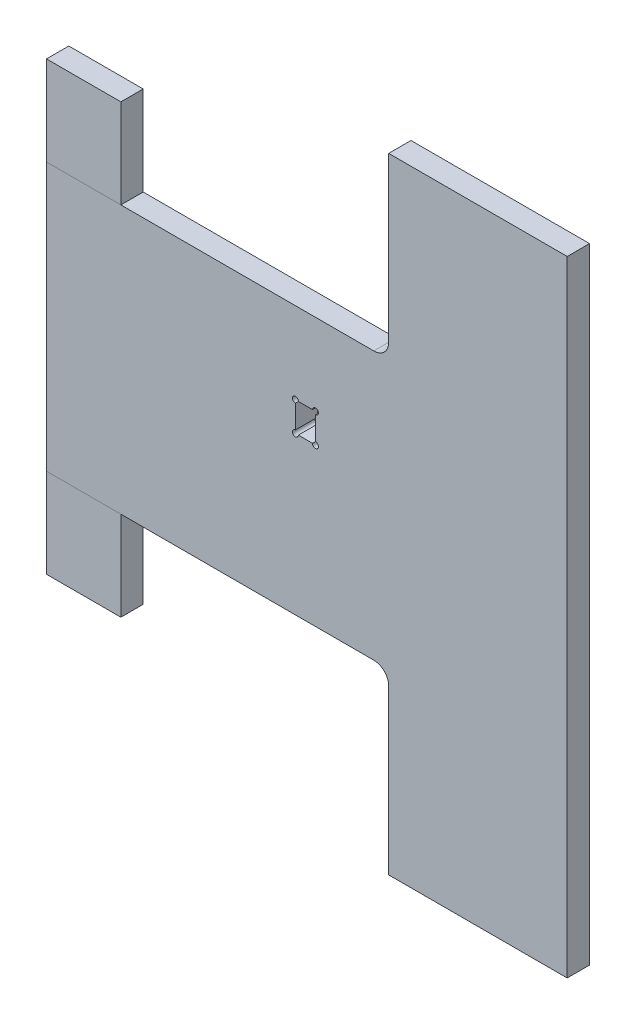
ISO-10303-21;
HEADER;
FILE_DESCRIPTION(('STEP AP214'),'2;1');
FILE_NAME('part.step','',(''),(''),'','','');
FILE_SCHEMA(('AUTOMOTIVE_DESIGN { 1 0 10303 214 1 1 1 1 }'));
ENDSEC;
DATA;
#1=APPLICATION_CONTEXT('core data for automotive mechanical design processes');
#2=APPLICATION_PROTOCOL_DEFINITION('international standard','automotive_design',2000,#1);
#3=PRODUCT_CONTEXT('',#1,'mechanical');
#4=PRODUCT('Part','Part','',(#3));
#5=PRODUCT_RELATED_PRODUCT_CATEGORY('part','',(#4));
#6=PRODUCT_DEFINITION_FORMATION('','',#4);
#7=PRODUCT_DEFINITION_CONTEXT('part definition',#1,'design');
#8=PRODUCT_DEFINITION('design','',#6,#7);
#9=PRODUCT_DEFINITION_SHAPE('','',#8);
#10=(LENGTH_UNIT() NAMED_UNIT(*) SI_UNIT(.MILLI.,.METRE.));
#11=(NAMED_UNIT(*) PLANE_ANGLE_UNIT() SI_UNIT($,.RADIAN.));
#12=(NAMED_UNIT(*) SI_UNIT($,.STERADIAN.) SOLID_ANGLE_UNIT());
#13=UNCERTAINTY_MEASURE_WITH_UNIT(LENGTH_MEASURE(1.E-05),#10,'distance_accuracy_value','');
#14=(GEOMETRIC_REPRESENTATION_CONTEXT(3) GLOBAL_UNCERTAINTY_ASSIGNED_CONTEXT((#13)) GLOBAL_UNIT_ASSIGNED_CONTEXT((#10,
#11,#12)) REPRESENTATION_CONTEXT('',''));
#15=CARTESIAN_POINT('',(0.,0.,0.));
#16=DIRECTION('',(0.,0.,1.));
#17=DIRECTION('',(1.,0.,0.));
#18=AXIS2_PLACEMENT_3D('',#15,#16,#17);
#19=CARTESIAN_POINT('',(0.,-60.,15.));
#20=DIRECTION('',(1.,0.,0.));
#21=DIRECTION('',(0.,0.,-1.));
#22=AXIS2_PLACEMENT_3D('',#19,#20,#21);
#23=PLANE('',#22);
#24=DIRECTION('',(0.,0.,-1.));
#25=VECTOR('',#24,1.);
#26=CARTESIAN_POINT('',(0.,0.,15.));
#27=LINE('',#26,#25);
#28=CARTESIAN_POINT('',(0.,0.,15.));
#29=VERTEX_POINT('',#28);
#30=CARTESIAN_POINT('',(0.,0.,0.));
#31=VERTEX_POINT('',#30);
#32=EDGE_CURVE('E107',#29,#31,#27,.T.);
#33=ORIENTED_EDGE('',*,*,#32,.T.);
#34=DIRECTION('',(0.,1.,0.));
#35=VECTOR('',#34,1.);
#36=CARTESIAN_POINT('',(0.,-60.,0.));
#37=LINE('',#36,#35);
#38=CARTESIAN_POINT('',(0.,-60.,0.));
#39=VERTEX_POINT('',#38);
#40=EDGE_CURVE('E12',#39,#31,#37,.T.);
#41=ORIENTED_EDGE('',*,*,#40,.F.);
#42=DIRECTION('',(0.,0.,-1.));
#43=VECTOR('',#42,1.);
#44=CARTESIAN_POINT('',(0.,-60.,15.));
#45=LINE('',#44,#43);
#46=CARTESIAN_POINT('',(0.,-60.,15.));
#47=VERTEX_POINT('',#46);
#48=EDGE_CURVE('E95',#47,#39,#45,.T.);
#49=ORIENTED_EDGE('',*,*,#48,.F.);
#50=DIRECTION('',(0.,1.,0.));
#51=VECTOR('',#50,1.);
#52=CARTESIAN_POINT('',(0.,-60.,15.));
#53=LINE('',#52,#51);
#54=EDGE_CURVE('E103',#47,#29,#53,.T.);
#55=ORIENTED_EDGE('',*,*,#54,.T.);
#56=EDGE_LOOP('',(#33,#41,#49,#55));
#57=FACE_BOUND('',#56,.T.);
#58=ADVANCED_FACE('F44',(#57),#23,.F.);
#59=CARTESIAN_POINT('',(0.,-60.,0.));
#60=DIRECTION('',(0.,0.,1.));
#61=DIRECTION('',(1.,0.,0.));
#62=AXIS2_PLACEMENT_3D('',#59,#60,#61);
#63=PLANE('',#62);
#64=DIRECTION('',(1.,0.,0.));
#65=VECTOR('',#64,1.);
#66=CARTESIAN_POINT('',(0.,0.,0.));
#67=LINE('',#66,#65);
#68=CARTESIAN_POINT('',(50.,0.,0.));
#69=VERTEX_POINT('',#68);
#70=EDGE_CURVE('E99',#31,#69,#67,.T.);
#71=ORIENTED_EDGE('',*,*,#70,.T.);
#72=DIRECTION('',(0.,1.,0.));
#73=VECTOR('',#72,1.);
#74=CARTESIAN_POINT('',(50.,-60.,0.));
#75=LINE('',#74,#73);
#76=CARTESIAN_POINT('',(50.,-60.,0.));
#77=VERTEX_POINT('',#76);
#78=EDGE_CURVE('E52',#77,#69,#75,.T.);
#79=ORIENTED_EDGE('',*,*,#78,.F.);
#80=DIRECTION('',(1.,0.,0.));
#81=VECTOR('',#80,1.);
#82=CARTESIAN_POINT('',(0.,-60.,0.));
#83=LINE('',#82,#81);
#84=EDGE_CURVE('E90',#39,#77,#83,.T.);
#85=ORIENTED_EDGE('',*,*,#84,.F.);
#86=ORIENTED_EDGE('',*,*,#40,.T.);
#87=EDGE_LOOP('',(#71,#79,#85,#86));
#88=FACE_BOUND('',#87,.T.);
#89=ADVANCED_FACE('F98',(#88),#63,.F.);
#90=CARTESIAN_POINT('',(50.,-60.,0.));
#91=DIRECTION('',(-1.,0.,0.));
#92=DIRECTION('',(0.,0.,1.));
#93=AXIS2_PLACEMENT_3D('',#90,#91,#92);
#94=PLANE('',#93);
#95=DIRECTION('',(0.,0.,1.));
#96=VECTOR('',#95,1.);
#97=CARTESIAN_POINT('',(50.,0.,0.));
#98=LINE('',#97,#96);
#99=CARTESIAN_POINT('',(50.,0.,15.));
#100=VERTEX_POINT('',#99);
#101=EDGE_CURVE('E77',#69,#100,#98,.T.);
#102=ORIENTED_EDGE('',*,*,#101,.T.);
#103=DIRECTION('',(0.,1.,0.));
#104=VECTOR('',#103,1.);
#105=CARTESIAN_POINT('',(50.,-60.,15.));
#106=LINE('',#105,#104);
#107=CARTESIAN_POINT('',(50.,-60.,15.));
#108=VERTEX_POINT('',#107);
#109=EDGE_CURVE('E100',#108,#100,#106,.T.);
#110=ORIENTED_EDGE('',*,*,#109,.F.);
#111=DIRECTION('',(0.,0.,1.));
#112=VECTOR('',#111,1.);
#113=CARTESIAN_POINT('',(50.,-60.,0.));
#114=LINE('',#113,#112);
#115=EDGE_CURVE('E93',#77,#108,#114,.T.);
#116=ORIENTED_EDGE('',*,*,#115,.F.);
#117=ORIENTED_EDGE('',*,*,#78,.T.);
#118=EDGE_LOOP('',(#102,#110,#116,#117));
#119=FACE_BOUND('',#118,.T.);
#120=ADVANCED_FACE('F101',(#119),#94,.F.);
#121=CARTESIAN_POINT('',(50.,-60.,15.));
#122=DIRECTION('',(0.,0.,-1.));
#123=DIRECTION('',(-1.,0.,0.));
#124=AXIS2_PLACEMENT_3D('',#121,#122,#123);
#125=PLANE('',#124);
#126=DIRECTION('',(-1.,0.,0.));
#127=VECTOR('',#126,1.);
#128=CARTESIAN_POINT('',(50.,0.,15.));
#129=LINE('',#128,#127);
#130=EDGE_CURVE('E83',#100,#29,#129,.T.);
#131=ORIENTED_EDGE('',*,*,#130,.T.);
#132=ORIENTED_EDGE('',*,*,#54,.F.);
#133=DIRECTION('',(-1.,0.,0.));
#134=VECTOR('',#133,1.);
#135=CARTESIAN_POINT('',(50.,-60.,15.));
#136=LINE('',#135,#134);
#137=EDGE_CURVE('E60',#108,#47,#136,.T.);
#138=ORIENTED_EDGE('',*,*,#137,.F.);
#139=ORIENTED_EDGE('',*,*,#109,.T.);
#140=EDGE_LOOP('',(#131,#132,#138,#139));
#141=FACE_BOUND('',#140,.T.);
#142=ADVANCED_FACE('F114',(#141),#125,.F.);
#143=CARTESIAN_POINT('',(0.,-60.,0.));
#144=DIRECTION('',(0.,-1.,0.));
#145=DIRECTION('',(0.,0.,-1.));
#146=AXIS2_PLACEMENT_3D('',#143,#144,#145);
#147=PLANE('',#146);
#148=ORIENTED_EDGE('',*,*,#48,.T.);
#149=ORIENTED_EDGE('',*,*,#84,.T.);
#150=ORIENTED_EDGE('',*,*,#115,.T.);
#151=ORIENTED_EDGE('',*,*,#137,.T.);
#152=EDGE_LOOP('',(#148,#149,#150,#151));
#153=FACE_BOUND('',#152,.T.);
#154=ADVANCED_FACE('F91',(#153),#147,.T.);
#155=CARTESIAN_POINT('',(0.,0.,0.));
#156=DIRECTION('',(0.,-1.,0.));
#157=DIRECTION('',(0.,0.,-1.));
#158=AXIS2_PLACEMENT_3D('',#155,#156,#157);
#159=PLANE('',#158);
#160=ORIENTED_EDGE('',*,*,#32,.F.);
#161=ORIENTED_EDGE('',*,*,#130,.F.);
#162=ORIENTED_EDGE('',*,*,#101,.F.);
#163=ORIENTED_EDGE('',*,*,#70,.F.);
#164=EDGE_LOOP('',(#160,#161,#162,#163));
#165=FACE_BOUND('',#164,.T.);
#166=ADVANCED_FACE('F117',(#165),#159,.F.);
#167=CLOSED_SHELL('',(#58,#89,#120,#142,#154,#166));
#168=MANIFOLD_SOLID_BREP('B2',#167);
#169=CARTESIAN_POINT('',(0.,240.,0.));
#170=DIRECTION('',(1.,0.,0.));
#171=DIRECTION('',(0.,0.,-1.));
#172=AXIS2_PLACEMENT_3D('',#169,#170,#171);
#173=PLANE('',#172);
#174=DIRECTION('',(0.,0.,1.));
#175=VECTOR('',#174,1.);
#176=CARTESIAN_POINT('',(0.,180.,0.));
#177=LINE('',#176,#175);
#178=CARTESIAN_POINT('',(0.,180.,0.));
#179=VERTEX_POINT('',#178);
#180=CARTESIAN_POINT('',(0.,180.,15.));
#181=VERTEX_POINT('',#180);
#182=EDGE_CURVE('E240',#179,#181,#177,.T.);
#183=ORIENTED_EDGE('',*,*,#182,.T.);
#184=DIRECTION('',(0.,-1.,0.));
#185=VECTOR('',#184,1.);
#186=CARTESIAN_POINT('',(0.,240.,15.));
#187=LINE('',#186,#185);
#188=CARTESIAN_POINT('',(0.,240.,15.));
#189=VERTEX_POINT('',#188);
#190=EDGE_CURVE('E42',#189,#181,#187,.T.);
#191=ORIENTED_EDGE('',*,*,#190,.F.);
#192=DIRECTION('',(0.,0.,1.));
#193=VECTOR('',#192,1.);
#194=CARTESIAN_POINT('',(0.,240.,0.));
#195=LINE('',#194,#193);
#196=CARTESIAN_POINT('',(0.,240.,0.));
#197=VERTEX_POINT('',#196);
#198=EDGE_CURVE('E228',#197,#189,#195,.T.);
#199=ORIENTED_EDGE('',*,*,#198,.F.);
#200=DIRECTION('',(0.,-1.,0.));
#201=VECTOR('',#200,1.);
#202=CARTESIAN_POINT('',(0.,240.,0.));
#203=LINE('',#202,#201);
#204=EDGE_CURVE('E236',#197,#179,#203,.T.);
#205=ORIENTED_EDGE('',*,*,#204,.T.);
#206=EDGE_LOOP('',(#183,#191,#199,#205));
#207=FACE_BOUND('',#206,.T.);
#208=ADVANCED_FACE('F177',(#207),#173,.F.);
#209=CARTESIAN_POINT('',(0.,240.,15.));
#210=DIRECTION('',(0.,0.,-1.));
#211=DIRECTION('',(-1.,0.,0.));
#212=AXIS2_PLACEMENT_3D('',#209,#210,#211);
#213=PLANE('',#212);
#214=DIRECTION('',(1.,0.,0.));
#215=VECTOR('',#214,1.);
#216=CARTESIAN_POINT('',(0.,180.,15.));
#217=LINE('',#216,#215);
#218=CARTESIAN_POINT('',(50.,180.,15.));
#219=VERTEX_POINT('',#218);
#220=EDGE_CURVE('E232',#181,#219,#217,.T.);
#221=ORIENTED_EDGE('',*,*,#220,.T.);
#222=DIRECTION('',(0.,-1.,0.));
#223=VECTOR('',#222,1.);
#224=CARTESIAN_POINT('',(50.,240.,15.));
#225=LINE('',#224,#223);
#226=CARTESIAN_POINT('',(50.,240.,15.));
#227=VERTEX_POINT('',#226);
#228=EDGE_CURVE('E185',#227,#219,#225,.T.);
#229=ORIENTED_EDGE('',*,*,#228,.F.);
#230=DIRECTION('',(1.,0.,0.));
#231=VECTOR('',#230,1.);
#232=CARTESIAN_POINT('',(0.,240.,15.));
#233=LINE('',#232,#231);
#234=EDGE_CURVE('E223',#189,#227,#233,.T.);
#235=ORIENTED_EDGE('',*,*,#234,.F.);
#236=ORIENTED_EDGE('',*,*,#190,.T.);
#237=EDGE_LOOP('',(#221,#229,#235,#236));
#238=FACE_BOUND('',#237,.T.);
#239=ADVANCED_FACE('F231',(#238),#213,.F.);
#240=CARTESIAN_POINT('',(50.,240.,15.));
#241=DIRECTION('',(-1.,0.,0.));
#242=DIRECTION('',(0.,0.,1.));
#243=AXIS2_PLACEMENT_3D('',#240,#241,#242);
#244=PLANE('',#243);
#245=DIRECTION('',(0.,0.,-1.));
#246=VECTOR('',#245,1.);
#247=CARTESIAN_POINT('',(50.,180.,15.));
#248=LINE('',#247,#246);
#249=CARTESIAN_POINT('',(50.,180.,0.));
#250=VERTEX_POINT('',#249);
#251=EDGE_CURVE('E210',#219,#250,#248,.T.);
#252=ORIENTED_EDGE('',*,*,#251,.T.);
#253=DIRECTION('',(0.,-1.,0.));
#254=VECTOR('',#253,1.);
#255=CARTESIAN_POINT('',(50.,240.,0.));
#256=LINE('',#255,#254);
#257=CARTESIAN_POINT('',(50.,240.,0.));
#258=VERTEX_POINT('',#257);
#259=EDGE_CURVE('E233',#258,#250,#256,.T.);
#260=ORIENTED_EDGE('',*,*,#259,.F.);
#261=DIRECTION('',(0.,0.,-1.));
#262=VECTOR('',#261,1.);
#263=CARTESIAN_POINT('',(50.,240.,15.));
#264=LINE('',#263,#262);
#265=EDGE_CURVE('E226',#227,#258,#264,.T.);
#266=ORIENTED_EDGE('',*,*,#265,.F.);
#267=ORIENTED_EDGE('',*,*,#228,.T.);
#268=EDGE_LOOP('',(#252,#260,#266,#267));
#269=FACE_BOUND('',#268,.T.);
#270=ADVANCED_FACE('F234',(#269),#244,.F.);
#271=CARTESIAN_POINT('',(50.,240.,0.));
#272=DIRECTION('',(0.,0.,1.));
#273=DIRECTION('',(1.,0.,0.));
#274=AXIS2_PLACEMENT_3D('',#271,#272,#273);
#275=PLANE('',#274);
#276=DIRECTION('',(-1.,0.,0.));
#277=VECTOR('',#276,1.);
#278=CARTESIAN_POINT('',(50.,180.,0.));
#279=LINE('',#278,#277);
#280=EDGE_CURVE('E216',#250,#179,#279,.T.);
#281=ORIENTED_EDGE('',*,*,#280,.T.);
#282=ORIENTED_EDGE('',*,*,#204,.F.);
#283=DIRECTION('',(-1.,0.,0.));
#284=VECTOR('',#283,1.);
#285=CARTESIAN_POINT('',(50.,240.,0.));
#286=LINE('',#285,#284);
#287=EDGE_CURVE('E193',#258,#197,#286,.T.);
#288=ORIENTED_EDGE('',*,*,#287,.F.);
#289=ORIENTED_EDGE('',*,*,#259,.T.);
#290=EDGE_LOOP('',(#281,#282,#288,#289));
#291=FACE_BOUND('',#290,.T.);
#292=ADVANCED_FACE('F247',(#291),#275,.F.);
#293=CARTESIAN_POINT('',(0.,240.,15.));
#294=DIRECTION('',(0.,1.,0.));
#295=DIRECTION('',(0.,0.,1.));
#296=AXIS2_PLACEMENT_3D('',#293,#294,#295);
#297=PLANE('',#296);
#298=ORIENTED_EDGE('',*,*,#198,.T.);
#299=ORIENTED_EDGE('',*,*,#234,.T.);
#300=ORIENTED_EDGE('',*,*,#265,.T.);
#301=ORIENTED_EDGE('',*,*,#287,.T.);
#302=EDGE_LOOP('',(#298,#299,#300,#301));
#303=FACE_BOUND('',#302,.T.);
#304=ADVANCED_FACE('F224',(#303),#297,.T.);
#305=CARTESIAN_POINT('',(0.,180.,15.));
#306=DIRECTION('',(0.,1.,0.));
#307=DIRECTION('',(0.,0.,1.));
#308=AXIS2_PLACEMENT_3D('',#305,#306,#307);
#309=PLANE('',#308);
#310=ORIENTED_EDGE('',*,*,#182,.F.);
#311=ORIENTED_EDGE('',*,*,#280,.F.);
#312=ORIENTED_EDGE('',*,*,#251,.F.);
#313=ORIENTED_EDGE('',*,*,#220,.F.);
#314=EDGE_LOOP('',(#310,#311,#312,#313));
#315=FACE_BOUND('',#314,.T.);
#316=ADVANCED_FACE('F250',(#315),#309,.F.);
#317=CLOSED_SHELL('',(#208,#239,#270,#292,#304,#316));
#318=MANIFOLD_SOLID_BREP('B6',#317);
#319=CARTESIAN_POINT('',(0.,0.,15.));
#320=DIRECTION('',(0.,1.,0.));
#321=DIRECTION('',(0.,0.,1.));
#322=AXIS2_PLACEMENT_3D('',#319,#320,#321);
#323=PLANE('',#322);
#324=DIRECTION('',(1.,0.,0.));
#325=VECTOR('',#324,1.);
#326=CARTESIAN_POINT('',(0.,0.,0.));
#327=LINE('',#326,#325);
#328=CARTESIAN_POINT('',(0.,0.,0.));
#329=VERTEX_POINT('',#328);
#330=CARTESIAN_POINT('',(220.,0.,0.));
#331=VERTEX_POINT('',#330);
#332=EDGE_CURVE('E532',#329,#331,#327,.T.);
#333=ORIENTED_EDGE('',*,*,#332,.T.);
#334=DIRECTION('',(0.,0.,-1.));
#335=VECTOR('',#334,1.);
#336=CARTESIAN_POINT('',(220.,0.,15.));
#337=LINE('',#336,#335);
#338=CARTESIAN_POINT('',(220.,0.,15.));
#339=VERTEX_POINT('',#338);
#340=EDGE_CURVE('E546',#331,#339,#337,.F.);
#341=ORIENTED_EDGE('',*,*,#340,.T.);
#342=DIRECTION('',(1.,0.,0.));
#343=VECTOR('',#342,1.);
#344=CARTESIAN_POINT('',(0.,0.,15.));
#345=LINE('',#344,#343);
#346=CARTESIAN_POINT('',(0.,0.,15.));
#347=VERTEX_POINT('',#346);
#348=EDGE_CURVE('E521',#347,#339,#345,.T.);
#349=ORIENTED_EDGE('',*,*,#348,.F.);
#350=DIRECTION('',(0.,0.,-1.));
#351=VECTOR('',#350,1.);
#352=CARTESIAN_POINT('',(0.,0.,15.));
#353=LINE('',#352,#351);
#354=EDGE_CURVE('E561',#347,#329,#353,.T.);
#355=ORIENTED_EDGE('',*,*,#354,.T.);
#356=EDGE_LOOP('',(#333,#341,#349,#355));
#357=FACE_BOUND('',#356,.T.);
#358=ADVANCED_FACE('F301',(#357),#323,.F.);
#359=CARTESIAN_POINT('',(0.,180.,15.));
#360=DIRECTION('',(0.,-1.,0.));
#361=DIRECTION('',(0.,0.,-1.));
#362=AXIS2_PLACEMENT_3D('',#359,#360,#361);
#363=PLANE('',#362);
#364=DIRECTION('',(-1.,0.,0.));
#365=VECTOR('',#364,1.);
#366=CARTESIAN_POINT('',(0.,180.,15.));
#367=LINE('',#366,#365);
#368=CARTESIAN_POINT('',(220.,180.,15.));
#369=VERTEX_POINT('',#368);
#370=CARTESIAN_POINT('',(0.,180.,15.));
#371=VERTEX_POINT('',#370);
#372=EDGE_CURVE('E531',#369,#371,#367,.T.);
#373=ORIENTED_EDGE('',*,*,#372,.F.);
#374=DIRECTION('',(0.,0.,1.));
#375=VECTOR('',#374,1.);
#376=CARTESIAN_POINT('',(220.,180.,0.));
#377=LINE('',#376,#375);
#378=CARTESIAN_POINT('',(220.,180.,0.));
#379=VERTEX_POINT('',#378);
#380=EDGE_CURVE('E323',#369,#379,#377,.F.);
#381=ORIENTED_EDGE('',*,*,#380,.T.);
#382=DIRECTION('',(-1.,0.,0.));
#383=VECTOR('',#382,1.);
#384=CARTESIAN_POINT('',(0.,180.,0.));
#385=LINE('',#384,#383);
#386=CARTESIAN_POINT('',(0.,180.,0.));
#387=VERTEX_POINT('',#386);
#388=EDGE_CURVE('E522',#379,#387,#385,.T.);
#389=ORIENTED_EDGE('',*,*,#388,.T.);
#390=DIRECTION('',(0.,0.,-1.));
#391=VECTOR('',#390,1.);
#392=CARTESIAN_POINT('',(0.,180.,15.));
#393=LINE('',#392,#391);
#394=EDGE_CURVE('E558',#371,#387,#393,.T.);
#395=ORIENTED_EDGE('',*,*,#394,.F.);
#396=EDGE_LOOP('',(#373,#381,#389,#395));
#397=FACE_BOUND('',#396,.T.);
#398=ADVANCED_FACE('F620',(#397),#363,.F.);
#399=CARTESIAN_POINT('',(0.,0.,15.));
#400=DIRECTION('',(1.,0.,0.));
#401=DIRECTION('',(0.,0.,-1.));
#402=AXIS2_PLACEMENT_3D('',#399,#400,#401);
#403=PLANE('',#402);
#404=DIRECTION('',(0.,-1.,0.));
#405=VECTOR('',#404,1.);
#406=CARTESIAN_POINT('',(0.,0.,0.));
#407=LINE('',#406,#405);
#408=EDGE_CURVE('E508',#387,#329,#407,.T.);
#409=ORIENTED_EDGE('',*,*,#408,.T.);
#410=ORIENTED_EDGE('',*,*,#354,.F.);
#411=DIRECTION('',(0.,-1.,0.));
#412=VECTOR('',#411,1.);
#413=CARTESIAN_POINT('',(0.,0.,15.));
#414=LINE('',#413,#412);
#415=EDGE_CURVE('E518',#371,#347,#414,.T.);
#416=ORIENTED_EDGE('',*,*,#415,.F.);
#417=ORIENTED_EDGE('',*,*,#394,.T.);
#418=EDGE_LOOP('',(#409,#410,#416,#417));
#419=FACE_BOUND('',#418,.T.);
#420=ADVANCED_FACE('F625',(#419),#403,.F.);
#421=CARTESIAN_POINT('',(0.,180.,15.));
#422=DIRECTION('',(0.,0.,-1.));
#423=DIRECTION('',(-1.,0.,0.));
#424=AXIS2_PLACEMENT_3D('',#421,#422,#423);
#425=PLANE('',#424);
#426=DIRECTION('',(0.,-1.,0.));
#427=VECTOR('',#426,1.);
#428=CARTESIAN_POINT('',(350.,180.,15.));
#429=LINE('',#428,#427);
#430=CARTESIAN_POINT('',(350.,300.,15.));
#431=VERTEX_POINT('',#430);
#432=CARTESIAN_POINT('',(350.,-120.,15.));
#433=VERTEX_POINT('',#432);
#434=EDGE_CURVE('E437',#431,#433,#429,.T.);
#435=ORIENTED_EDGE('',*,*,#434,.F.);
#436=DIRECTION('',(1.,0.,0.));
#437=VECTOR('',#436,1.);
#438=CARTESIAN_POINT('',(330.,300.,15.));
#439=LINE('',#438,#437);
#440=CARTESIAN_POINT('',(230.,300.,15.));
#441=VERTEX_POINT('',#440);
#442=EDGE_CURVE('E426',#441,#431,#439,.T.);
#443=ORIENTED_EDGE('',*,*,#442,.F.);
#444=DIRECTION('',(0.,-1.,0.));
#445=VECTOR('',#444,1.);
#446=CARTESIAN_POINT('',(230.,300.,15.));
#447=LINE('',#446,#445);
#448=CARTESIAN_POINT('',(230.,190.,15.));
#449=VERTEX_POINT('',#448);
#450=EDGE_CURVE('E434',#441,#449,#447,.T.);
#451=ORIENTED_EDGE('',*,*,#450,.T.);
#452=CARTESIAN_POINT('',(220.,190.,15.));
#453=DIRECTION('',(0.,0.,-1.));
#454=DIRECTION('',(-1.,0.,0.));
#455=AXIS2_PLACEMENT_3D('',#452,#453,#454);
#456=CIRCLE('',#455,10.);
#457=EDGE_CURVE('E316',#449,#369,#456,.T.);
#458=ORIENTED_EDGE('',*,*,#457,.T.);
#459=ORIENTED_EDGE('',*,*,#372,.T.);
#460=ORIENTED_EDGE('',*,*,#415,.T.);
#461=ORIENTED_EDGE('',*,*,#348,.T.);
#462=CARTESIAN_POINT('',(220.,-9.99999999999999,15.));
#463=DIRECTION('',(0.,0.,-1.));
#464=DIRECTION('',(-1.,0.,0.));
#465=AXIS2_PLACEMENT_3D('',#462,#463,#464);
#466=CIRCLE('',#465,10.);
#467=CARTESIAN_POINT('',(230.,-9.99999999999999,15.));
#468=VERTEX_POINT('',#467);
#469=EDGE_CURVE('E587',#339,#468,#466,.T.);
#470=ORIENTED_EDGE('',*,*,#469,.T.);
#471=DIRECTION('',(0.,1.,0.));
#472=VECTOR('',#471,1.);
#473=CARTESIAN_POINT('',(230.,-120.,15.));
#474=LINE('',#473,#472);
#475=CARTESIAN_POINT('',(230.,-120.,15.));
#476=VERTEX_POINT('',#475);
#477=EDGE_CURVE('E460',#476,#468,#474,.T.);
#478=ORIENTED_EDGE('',*,*,#477,.F.);
#479=DIRECTION('',(-1.,0.,0.));
#480=VECTOR('',#479,1.);
#481=CARTESIAN_POINT('',(330.,-120.,15.));
#482=LINE('',#481,#480);
#483=EDGE_CURVE('E441',#433,#476,#482,.T.);
#484=ORIENTED_EDGE('',*,*,#483,.F.);
#485=EDGE_LOOP('',(#435,#443,#451,#458,#459,#460,#461,#470,#478,#484));
#486=FACE_BOUND('',#485,.T.);
#487=DIRECTION('',(-1.,0.,0.));
#488=VECTOR('',#487,1.);
#489=CARTESIAN_POINT('',(180.8,125.25,15.));
#490=LINE('',#489,#488);
#491=CARTESIAN_POINT('',(178.8,125.25,15.));
#492=VERTEX_POINT('',#491);
#493=CARTESIAN_POINT('',(169.3,125.25,15.));
#494=VERTEX_POINT('',#493);
#495=EDGE_CURVE('E500',#492,#494,#490,.T.);
#496=ORIENTED_EDGE('',*,*,#495,.F.);
#497=CARTESIAN_POINT('',(180.8,125.25,15.));
#498=DIRECTION('',(0.,0.,1.));
#499=DIRECTION('',(1.,0.,0.));
#500=AXIS2_PLACEMENT_3D('',#497,#498,#499);
#501=CIRCLE('',#500,2.);
#502=CARTESIAN_POINT('',(180.8,123.25,15.));
#503=VERTEX_POINT('',#502);
#504=EDGE_CURVE('E466',#503,#492,#501,.T.);
#505=ORIENTED_EDGE('',*,*,#504,.F.);
#506=DIRECTION('',(0.,1.,0.));
#507=VECTOR('',#506,1.);
#508=CARTESIAN_POINT('',(180.8,105.65,15.));
#509=LINE('',#508,#507);
#510=CARTESIAN_POINT('',(180.8,107.65,15.));
#511=VERTEX_POINT('',#510);
#512=EDGE_CURVE('E514',#511,#503,#509,.T.);
#513=ORIENTED_EDGE('',*,*,#512,.F.);
#514=CARTESIAN_POINT('',(180.8,105.65,15.));
#515=DIRECTION('',(0.,0.,1.));
#516=DIRECTION('',(1.,0.,0.));
#517=AXIS2_PLACEMENT_3D('',#514,#515,#516);
#518=CIRCLE('',#517,2.);
#519=CARTESIAN_POINT('',(178.8,105.65,15.));
#520=VERTEX_POINT('',#519);
#521=EDGE_CURVE('E471',#520,#511,#518,.T.);
#522=ORIENTED_EDGE('',*,*,#521,.F.);
#523=DIRECTION('',(1.,0.,0.));
#524=VECTOR('',#523,1.);
#525=CARTESIAN_POINT('',(167.3,105.65,15.));
#526=LINE('',#525,#524);
#527=CARTESIAN_POINT('',(169.3,105.65,15.));
#528=VERTEX_POINT('',#527);
#529=EDGE_CURVE('E511',#528,#520,#526,.T.);
#530=ORIENTED_EDGE('',*,*,#529,.F.);
#531=CARTESIAN_POINT('',(167.3,105.65,15.));
#532=DIRECTION('',(0.,0.,1.));
#533=DIRECTION('',(1.,0.,0.));
#534=AXIS2_PLACEMENT_3D('',#531,#532,#533);
#535=CIRCLE('',#534,2.);
#536=CARTESIAN_POINT('',(167.3,107.65,15.));
#537=VERTEX_POINT('',#536);
#538=EDGE_CURVE('E479',#537,#528,#535,.T.);
#539=ORIENTED_EDGE('',*,*,#538,.F.);
#540=DIRECTION('',(0.,-1.,0.));
#541=VECTOR('',#540,1.);
#542=CARTESIAN_POINT('',(167.3,125.25,15.));
#543=LINE('',#542,#541);
#544=CARTESIAN_POINT('',(167.3,123.25,15.));
#545=VERTEX_POINT('',#544);
#546=EDGE_CURVE('E495',#545,#537,#543,.T.);
#547=ORIENTED_EDGE('',*,*,#546,.F.);
#548=CARTESIAN_POINT('',(167.3,125.25,15.));
#549=DIRECTION('',(0.,0.,1.));
#550=DIRECTION('',(1.,0.,0.));
#551=AXIS2_PLACEMENT_3D('',#548,#549,#550);
#552=CIRCLE('',#551,2.);
#553=EDGE_CURVE('E487',#494,#545,#552,.T.);
#554=ORIENTED_EDGE('',*,*,#553,.F.);
#555=EDGE_LOOP('',(#496,#505,#513,#522,#530,#539,#547,#554));
#556=FACE_BOUND('',#555,.T.);
#557=ADVANCED_FACE('F438',(#486,#556),#425,.F.);
#558=CARTESIAN_POINT('',(0.,180.,0.));
#559=DIRECTION('',(0.,0.,-1.));
#560=DIRECTION('',(-1.,0.,0.));
#561=AXIS2_PLACEMENT_3D('',#558,#559,#560);
#562=PLANE('',#561);
#563=DIRECTION('',(-1.,0.,0.));
#564=VECTOR('',#563,1.);
#565=CARTESIAN_POINT('',(330.,300.,0.));
#566=LINE('',#565,#564);
#567=CARTESIAN_POINT('',(350.,300.,0.));
#568=VERTEX_POINT('',#567);
#569=CARTESIAN_POINT('',(230.,300.,0.));
#570=VERTEX_POINT('',#569);
#571=EDGE_CURVE('E458',#568,#570,#566,.T.);
#572=ORIENTED_EDGE('',*,*,#571,.F.);
#573=DIRECTION('',(0.,1.,0.));
#574=VECTOR('',#573,1.);
#575=CARTESIAN_POINT('',(350.,180.,0.));
#576=LINE('',#575,#574);
#577=CARTESIAN_POINT('',(350.,-120.,0.));
#578=VERTEX_POINT('',#577);
#579=EDGE_CURVE('E175',#578,#568,#576,.T.);
#580=ORIENTED_EDGE('',*,*,#579,.F.);
#581=DIRECTION('',(1.,0.,0.));
#582=VECTOR('',#581,1.);
#583=CARTESIAN_POINT('',(330.,-120.,0.));
#584=LINE('',#583,#582);
#585=CARTESIAN_POINT('',(230.,-120.,0.));
#586=VERTEX_POINT('',#585);
#587=EDGE_CURVE('E455',#586,#578,#584,.T.);
#588=ORIENTED_EDGE('',*,*,#587,.F.);
#589=DIRECTION('',(0.,1.,0.));
#590=VECTOR('',#589,1.);
#591=CARTESIAN_POINT('',(230.,-120.,0.));
#592=LINE('',#591,#590);
#593=CARTESIAN_POINT('',(230.,-9.99999999999999,0.));
#594=VERTEX_POINT('',#593);
#595=EDGE_CURVE('E457',#586,#594,#592,.T.);
#596=ORIENTED_EDGE('',*,*,#595,.T.);
#597=CARTESIAN_POINT('',(220.,-9.99999999999999,0.));
#598=DIRECTION('',(0.,0.,-1.));
#599=DIRECTION('',(-1.,0.,0.));
#600=AXIS2_PLACEMENT_3D('',#597,#598,#599);
#601=CIRCLE('',#600,10.);
#602=EDGE_CURVE('E589',#594,#331,#601,.F.);
#603=ORIENTED_EDGE('',*,*,#602,.T.);
#604=ORIENTED_EDGE('',*,*,#332,.F.);
#605=ORIENTED_EDGE('',*,*,#408,.F.);
#606=ORIENTED_EDGE('',*,*,#388,.F.);
#607=CARTESIAN_POINT('',(220.,190.,0.));
#608=DIRECTION('',(0.,0.,-1.));
#609=DIRECTION('',(-1.,0.,0.));
#610=AXIS2_PLACEMENT_3D('',#607,#608,#609);
#611=CIRCLE('',#610,10.);
#612=CARTESIAN_POINT('',(230.,190.,0.));
#613=VERTEX_POINT('',#612);
#614=EDGE_CURVE('E309',#379,#613,#611,.F.);
#615=ORIENTED_EDGE('',*,*,#614,.T.);
#616=DIRECTION('',(0.,-1.,0.));
#617=VECTOR('',#616,1.);
#618=CARTESIAN_POINT('',(230.,300.,0.));
#619=LINE('',#618,#617);
#620=EDGE_CURVE('E468',#570,#613,#619,.T.);
#621=ORIENTED_EDGE('',*,*,#620,.F.);
#622=EDGE_LOOP('',(#572,#580,#588,#596,#603,#604,#605,#606,#615,#621));
#623=FACE_BOUND('',#622,.T.);
#624=CARTESIAN_POINT('',(180.8,125.25,0.));
#625=DIRECTION('',(0.,0.,1.));
#626=DIRECTION('',(1.,0.,0.));
#627=AXIS2_PLACEMENT_3D('',#624,#625,#626);
#628=CIRCLE('',#627,2.);
#629=CARTESIAN_POINT('',(180.8,123.25,0.));
#630=VERTEX_POINT('',#629);
#631=CARTESIAN_POINT('',(178.8,125.25,0.));
#632=VERTEX_POINT('',#631);
#633=EDGE_CURVE('E462',#630,#632,#628,.T.);
#634=ORIENTED_EDGE('',*,*,#633,.T.);
#635=DIRECTION('',(-1.,0.,0.));
#636=VECTOR('',#635,1.);
#637=CARTESIAN_POINT('',(180.8,125.25,0.));
#638=LINE('',#637,#636);
#639=CARTESIAN_POINT('',(169.3,125.25,0.));
#640=VERTEX_POINT('',#639);
#641=EDGE_CURVE('E506',#632,#640,#638,.T.);
#642=ORIENTED_EDGE('',*,*,#641,.T.);
#643=CARTESIAN_POINT('',(167.3,125.25,0.));
#644=DIRECTION('',(0.,0.,1.));
#645=DIRECTION('',(1.,0.,0.));
#646=AXIS2_PLACEMENT_3D('',#643,#644,#645);
#647=CIRCLE('',#646,2.);
#648=CARTESIAN_POINT('',(167.3,123.25,0.));
#649=VERTEX_POINT('',#648);
#650=EDGE_CURVE('E488',#640,#649,#647,.T.);
#651=ORIENTED_EDGE('',*,*,#650,.T.);
#652=DIRECTION('',(0.,-1.,0.));
#653=VECTOR('',#652,1.);
#654=CARTESIAN_POINT('',(167.3,125.25,0.));
#655=LINE('',#654,#653);
#656=CARTESIAN_POINT('',(167.3,107.65,0.));
#657=VERTEX_POINT('',#656);
#658=EDGE_CURVE('E496',#649,#657,#655,.T.);
#659=ORIENTED_EDGE('',*,*,#658,.T.);
#660=CARTESIAN_POINT('',(167.3,105.65,0.));
#661=DIRECTION('',(0.,0.,1.));
#662=DIRECTION('',(1.,0.,0.));
#663=AXIS2_PLACEMENT_3D('',#660,#661,#662);
#664=CIRCLE('',#663,2.);
#665=CARTESIAN_POINT('',(169.3,105.65,0.));
#666=VERTEX_POINT('',#665);
#667=EDGE_CURVE('E480',#657,#666,#664,.T.);
#668=ORIENTED_EDGE('',*,*,#667,.T.);
#669=DIRECTION('',(1.,0.,0.));
#670=VECTOR('',#669,1.);
#671=CARTESIAN_POINT('',(167.3,105.65,0.));
#672=LINE('',#671,#670);
#673=CARTESIAN_POINT('',(178.8,105.65,0.));
#674=VERTEX_POINT('',#673);
#675=EDGE_CURVE('E499',#666,#674,#672,.T.);
#676=ORIENTED_EDGE('',*,*,#675,.T.);
#677=CARTESIAN_POINT('',(180.8,105.65,0.));
#678=DIRECTION('',(0.,0.,1.));
#679=DIRECTION('',(1.,0.,0.));
#680=AXIS2_PLACEMENT_3D('',#677,#678,#679);
#681=CIRCLE('',#680,2.);
#682=CARTESIAN_POINT('',(180.8,107.65,0.));
#683=VERTEX_POINT('',#682);
#684=EDGE_CURVE('E472',#674,#683,#681,.T.);
#685=ORIENTED_EDGE('',*,*,#684,.T.);
#686=DIRECTION('',(0.,1.,0.));
#687=VECTOR('',#686,1.);
#688=CARTESIAN_POINT('',(180.8,105.65,0.));
#689=LINE('',#688,#687);
#690=EDGE_CURVE('E503',#683,#630,#689,.T.);
#691=ORIENTED_EDGE('',*,*,#690,.T.);
#692=EDGE_LOOP('',(#634,#642,#651,#659,#668,#676,#685,#691));
#693=FACE_BOUND('',#692,.T.);
#694=ADVANCED_FACE('F593',(#623,#693),#562,.T.);
#695=CARTESIAN_POINT('',(167.3,125.25,0.));
#696=DIRECTION('',(-1.,0.,0.));
#697=DIRECTION('',(0.,0.,1.));
#698=AXIS2_PLACEMENT_3D('',#695,#696,#697);
#699=PLANE('',#698);
#700=ORIENTED_EDGE('',*,*,#546,.T.);
#701=DIRECTION('',(0.,0.,1.));
#702=VECTOR('',#701,1.);
#703=CARTESIAN_POINT('',(167.3,107.65,0.));
#704=LINE('',#703,#702);
#705=EDGE_CURVE('E483',#537,#657,#704,.F.);
#706=ORIENTED_EDGE('',*,*,#705,.T.);
#707=ORIENTED_EDGE('',*,*,#658,.F.);
#708=DIRECTION('',(0.,0.,1.));
#709=VECTOR('',#708,1.);
#710=CARTESIAN_POINT('',(167.3,123.25,0.));
#711=LINE('',#710,#709);
#712=EDGE_CURVE('E491',#649,#545,#711,.T.);
#713=ORIENTED_EDGE('',*,*,#712,.T.);
#714=EDGE_LOOP('',(#700,#706,#707,#713));
#715=FACE_BOUND('',#714,.T.);
#716=ADVANCED_FACE('F640',(#715),#699,.F.);
#717=CARTESIAN_POINT('',(180.8,125.25,0.));
#718=DIRECTION('',(0.,1.,0.));
#719=DIRECTION('',(0.,0.,1.));
#720=AXIS2_PLACEMENT_3D('',#717,#718,#719);
#721=PLANE('',#720);
#722=ORIENTED_EDGE('',*,*,#641,.F.);
#723=DIRECTION('',(0.,0.,1.));
#724=VECTOR('',#723,1.);
#725=CARTESIAN_POINT('',(178.8,125.25,0.));
#726=LINE('',#725,#724);
#727=EDGE_CURVE('E465',#632,#492,#726,.T.);
#728=ORIENTED_EDGE('',*,*,#727,.T.);
#729=ORIENTED_EDGE('',*,*,#495,.T.);
#730=DIRECTION('',(0.,0.,1.));
#731=VECTOR('',#730,1.);
#732=CARTESIAN_POINT('',(169.3,125.25,0.));
#733=LINE('',#732,#731);
#734=EDGE_CURVE('E564',#494,#640,#733,.F.);
#735=ORIENTED_EDGE('',*,*,#734,.T.);
#736=EDGE_LOOP('',(#722,#728,#729,#735));
#737=FACE_BOUND('',#736,.T.);
#738=ADVANCED_FACE('F644',(#737),#721,.F.);
#739=CARTESIAN_POINT('',(180.8,105.65,0.));
#740=DIRECTION('',(1.,0.,0.));
#741=DIRECTION('',(0.,1.,0.));
#742=AXIS2_PLACEMENT_3D('',#739,#740,#741);
#743=PLANE('',#742);
#744=ORIENTED_EDGE('',*,*,#512,.T.);
#745=DIRECTION('',(0.,0.,1.));
#746=VECTOR('',#745,1.);
#747=CARTESIAN_POINT('',(180.8,123.25,0.));
#748=LINE('',#747,#746);
#749=EDGE_CURVE('E547',#503,#630,#748,.F.);
#750=ORIENTED_EDGE('',*,*,#749,.T.);
#751=ORIENTED_EDGE('',*,*,#690,.F.);
#752=DIRECTION('',(0.,0.,1.));
#753=VECTOR('',#752,1.);
#754=CARTESIAN_POINT('',(180.8,107.65,0.));
#755=LINE('',#754,#753);
#756=EDGE_CURVE('E475',#683,#511,#755,.T.);
#757=ORIENTED_EDGE('',*,*,#756,.T.);
#758=EDGE_LOOP('',(#744,#750,#751,#757));
#759=FACE_BOUND('',#758,.T.);
#760=ADVANCED_FACE('F650',(#759),#743,.F.);
#761=CARTESIAN_POINT('',(167.3,105.65,0.));
#762=DIRECTION('',(0.,-1.,0.));
#763=DIRECTION('',(0.,0.,-1.));
#764=AXIS2_PLACEMENT_3D('',#761,#762,#763);
#765=PLANE('',#764);
#766=ORIENTED_EDGE('',*,*,#529,.T.);
#767=DIRECTION('',(0.,0.,1.));
#768=VECTOR('',#767,1.);
#769=CARTESIAN_POINT('',(178.8,105.65,0.));
#770=LINE('',#769,#768);
#771=EDGE_CURVE('E570',#520,#674,#770,.F.);
#772=ORIENTED_EDGE('',*,*,#771,.T.);
#773=ORIENTED_EDGE('',*,*,#675,.F.);
#774=DIRECTION('',(0.,0.,1.));
#775=VECTOR('',#774,1.);
#776=CARTESIAN_POINT('',(169.3,105.65,0.));
#777=LINE('',#776,#775);
#778=EDGE_CURVE('E567',#666,#528,#777,.T.);
#779=ORIENTED_EDGE('',*,*,#778,.T.);
#780=EDGE_LOOP('',(#766,#772,#773,#779));
#781=FACE_BOUND('',#780,.T.);
#782=ADVANCED_FACE('F646',(#781),#765,.F.);
#783=CARTESIAN_POINT('',(167.3,125.25,0.));
#784=DIRECTION('',(0.,0.,1.));
#785=DIRECTION('',(1.,0.,0.));
#786=AXIS2_PLACEMENT_3D('',#783,#784,#785);
#787=CYLINDRICAL_SURFACE('',#786,2.);
#788=ORIENTED_EDGE('',*,*,#650,.F.);
#789=ORIENTED_EDGE('',*,*,#734,.F.);
#790=ORIENTED_EDGE('',*,*,#553,.T.);
#791=ORIENTED_EDGE('',*,*,#712,.F.);
#792=EDGE_LOOP('',(#788,#789,#790,#791));
#793=FACE_BOUND('',#792,.T.);
#794=ADVANCED_FACE('F649',(#793),#787,.F.);
#795=CARTESIAN_POINT('',(167.3,105.65,0.));
#796=DIRECTION('',(0.,0.,1.));
#797=DIRECTION('',(1.,0.,0.));
#798=AXIS2_PLACEMENT_3D('',#795,#796,#797);
#799=CYLINDRICAL_SURFACE('',#798,2.);
#800=ORIENTED_EDGE('',*,*,#538,.T.);
#801=ORIENTED_EDGE('',*,*,#778,.F.);
#802=ORIENTED_EDGE('',*,*,#667,.F.);
#803=ORIENTED_EDGE('',*,*,#705,.F.);
#804=EDGE_LOOP('',(#800,#801,#802,#803));
#805=FACE_BOUND('',#804,.T.);
#806=ADVANCED_FACE('F660',(#805),#799,.F.);
#807=CARTESIAN_POINT('',(180.8,105.65,0.));
#808=DIRECTION('',(0.,0.,1.));
#809=DIRECTION('',(1.,0.,0.));
#810=AXIS2_PLACEMENT_3D('',#807,#808,#809);
#811=CYLINDRICAL_SURFACE('',#810,2.);
#812=ORIENTED_EDGE('',*,*,#684,.F.);
#813=ORIENTED_EDGE('',*,*,#771,.F.);
#814=ORIENTED_EDGE('',*,*,#521,.T.);
#815=ORIENTED_EDGE('',*,*,#756,.F.);
#816=EDGE_LOOP('',(#812,#813,#814,#815));
#817=FACE_BOUND('',#816,.T.);
#818=ADVANCED_FACE('F664',(#817),#811,.F.);
#819=CARTESIAN_POINT('',(180.8,125.25,0.));
#820=DIRECTION('',(0.,0.,1.));
#821=DIRECTION('',(1.,0.,0.));
#822=AXIS2_PLACEMENT_3D('',#819,#820,#821);
#823=CYLINDRICAL_SURFACE('',#822,2.);
#824=ORIENTED_EDGE('',*,*,#633,.F.);
#825=ORIENTED_EDGE('',*,*,#749,.F.);
#826=ORIENTED_EDGE('',*,*,#504,.T.);
#827=ORIENTED_EDGE('',*,*,#727,.F.);
#828=EDGE_LOOP('',(#824,#825,#826,#827));
#829=FACE_BOUND('',#828,.T.);
#830=ADVANCED_FACE('F668',(#829),#823,.F.);
#831=CARTESIAN_POINT('',(230.,300.,0.));
#832=DIRECTION('',(1.,0.,0.));
#833=DIRECTION('',(0.,0.,-1.));
#834=AXIS2_PLACEMENT_3D('',#831,#832,#833);
#835=PLANE('',#834);
#836=ORIENTED_EDGE('',*,*,#620,.T.);
#837=DIRECTION('',(0.,0.,1.));
#838=VECTOR('',#837,1.);
#839=CARTESIAN_POINT('',(230.,190.,15.));
#840=LINE('',#839,#838);
#841=EDGE_CURVE('E549',#613,#449,#840,.T.);
#842=ORIENTED_EDGE('',*,*,#841,.T.);
#843=ORIENTED_EDGE('',*,*,#450,.F.);
#844=DIRECTION('',(0.,0.,1.));
#845=VECTOR('',#844,1.);
#846=CARTESIAN_POINT('',(230.,300.,0.));
#847=LINE('',#846,#845);
#848=EDGE_CURVE('E432',#570,#441,#847,.T.);
#849=ORIENTED_EDGE('',*,*,#848,.F.);
#850=EDGE_LOOP('',(#836,#842,#843,#849));
#851=FACE_BOUND('',#850,.T.);
#852=ADVANCED_FACE('F583',(#851),#835,.F.);
#853=CARTESIAN_POINT('',(330.,300.,15.));
#854=DIRECTION('',(0.,-1.,0.));
#855=DIRECTION('',(0.,0.,-1.));
#856=AXIS2_PLACEMENT_3D('',#853,#854,#855);
#857=PLANE('',#856);
#858=ORIENTED_EDGE('',*,*,#442,.T.);
#859=DIRECTION('',(0.,0.,1.));
#860=VECTOR('',#859,1.);
#861=CARTESIAN_POINT('',(350.,300.,-121.655250605964));
#862=LINE('',#861,#860);
#863=EDGE_CURVE('E430',#568,#431,#862,.T.);
#864=ORIENTED_EDGE('',*,*,#863,.F.);
#865=ORIENTED_EDGE('',*,*,#571,.T.);
#866=ORIENTED_EDGE('',*,*,#848,.T.);
#867=EDGE_LOOP('',(#858,#864,#865,#866));
#868=FACE_BOUND('',#867,.T.);
#869=ADVANCED_FACE('F428',(#868),#857,.F.);
#870=CARTESIAN_POINT('',(230.,-120.,15.));
#871=DIRECTION('',(1.,0.,0.));
#872=DIRECTION('',(0.,0.,-1.));
#873=AXIS2_PLACEMENT_3D('',#870,#871,#872);
#874=PLANE('',#873);
#875=ORIENTED_EDGE('',*,*,#477,.T.);
#876=DIRECTION('',(0.,0.,-1.));
#877=VECTOR('',#876,1.);
#878=CARTESIAN_POINT('',(230.,-9.99999999999999,0.));
#879=LINE('',#878,#877);
#880=EDGE_CURVE('E543',#468,#594,#879,.T.);
#881=ORIENTED_EDGE('',*,*,#880,.T.);
#882=ORIENTED_EDGE('',*,*,#595,.F.);
#883=DIRECTION('',(0.,0.,-1.));
#884=VECTOR('',#883,1.);
#885=CARTESIAN_POINT('',(230.,-120.,15.));
#886=LINE('',#885,#884);
#887=EDGE_CURVE('E453',#476,#586,#886,.T.);
#888=ORIENTED_EDGE('',*,*,#887,.F.);
#889=EDGE_LOOP('',(#875,#881,#882,#888));
#890=FACE_BOUND('',#889,.T.);
#891=ADVANCED_FACE('F608',(#890),#874,.F.);
#892=CARTESIAN_POINT('',(330.,-120.,0.));
#893=DIRECTION('',(0.,1.,0.));
#894=DIRECTION('',(0.,0.,1.));
#895=AXIS2_PLACEMENT_3D('',#892,#893,#894);
#896=PLANE('',#895);
#897=ORIENTED_EDGE('',*,*,#587,.T.);
#898=DIRECTION('',(0.,0.,1.));
#899=VECTOR('',#898,1.);
#900=CARTESIAN_POINT('',(350.,-120.,-121.655250605964));
#901=LINE('',#900,#899);
#902=EDGE_CURVE('E445',#578,#433,#901,.T.);
#903=ORIENTED_EDGE('',*,*,#902,.T.);
#904=ORIENTED_EDGE('',*,*,#483,.T.);
#905=ORIENTED_EDGE('',*,*,#887,.T.);
#906=EDGE_LOOP('',(#897,#903,#904,#905));
#907=FACE_BOUND('',#906,.T.);
#908=ADVANCED_FACE('F610',(#907),#896,.F.);
#909=CARTESIAN_POINT('',(220.,-9.99999999999999,15.));
#910=DIRECTION('',(0.,0.,1.));
#911=DIRECTION('',(1.,0.,0.));
#912=AXIS2_PLACEMENT_3D('',#909,#910,#911);
#913=CYLINDRICAL_SURFACE('',#912,10.);
#914=ORIENTED_EDGE('',*,*,#469,.F.);
#915=ORIENTED_EDGE('',*,*,#340,.F.);
#916=ORIENTED_EDGE('',*,*,#602,.F.);
#917=ORIENTED_EDGE('',*,*,#880,.F.);
#918=EDGE_LOOP('',(#914,#915,#916,#917));
#919=FACE_BOUND('',#918,.T.);
#920=ADVANCED_FACE('F605',(#919),#913,.F.);
#921=CARTESIAN_POINT('',(220.,190.,0.));
#922=DIRECTION('',(0.,0.,-1.));
#923=DIRECTION('',(-1.,0.,0.));
#924=AXIS2_PLACEMENT_3D('',#921,#922,#923);
#925=CYLINDRICAL_SURFACE('',#924,10.);
#926=ORIENTED_EDGE('',*,*,#614,.F.);
#927=ORIENTED_EDGE('',*,*,#380,.F.);
#928=ORIENTED_EDGE('',*,*,#457,.F.);
#929=ORIENTED_EDGE('',*,*,#841,.F.);
#930=EDGE_LOOP('',(#926,#927,#928,#929));
#931=FACE_BOUND('',#930,.T.);
#932=ADVANCED_FACE('F303',(#931),#925,.F.);
#933=CARTESIAN_POINT('',(350.,180.,-105.));
#934=DIRECTION('',(-1.,0.,0.));
#935=DIRECTION('',(0.,0.,1.));
#936=AXIS2_PLACEMENT_3D('',#933,#934,#935);
#937=PLANE('',#936);
#938=ORIENTED_EDGE('',*,*,#579,.T.);
#939=ORIENTED_EDGE('',*,*,#863,.T.);
#940=ORIENTED_EDGE('',*,*,#434,.T.);
#941=ORIENTED_EDGE('',*,*,#902,.F.);
#942=EDGE_LOOP('',(#938,#939,#940,#941));
#943=FACE_BOUND('',#942,.T.);
#944=ADVANCED_FACE('F447',(#943),#937,.F.);
#945=CLOSED_SHELL('',(#358,#398,#420,#557,#694,#716,#738,#760,#782,#794,#806,#818,#830,#852,
#869,#891,#908,#920,#932,#944));
#946=MANIFOLD_SOLID_BREP('B36',#945);
#947=ADVANCED_BREP_SHAPE_REPRESENTATION('',(#18,#168,#318,#946),#14);
#948=SHAPE_DEFINITION_REPRESENTATION(#9,#947);
ENDSEC;
END-ISO-10303-21;
